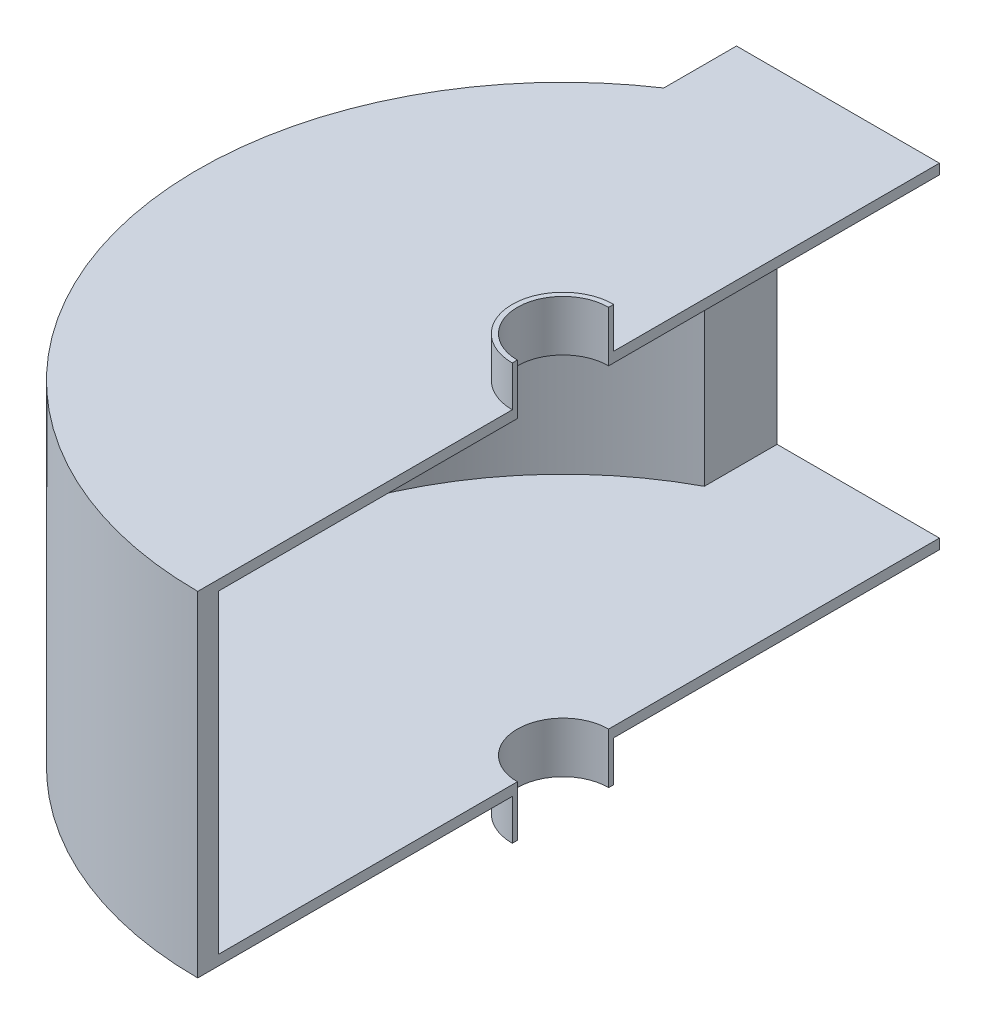
ISO-10303-21;
HEADER;
FILE_DESCRIPTION(('STEP AP214'),'2;1');
FILE_NAME('part.step','',(''),(''),'','','');
FILE_SCHEMA(('AUTOMOTIVE_DESIGN { 1 0 10303 214 1 1 1 1 }'));
ENDSEC;
DATA;
#1=APPLICATION_CONTEXT('core data for automotive mechanical design processes');
#2=APPLICATION_PROTOCOL_DEFINITION('international standard','automotive_design',2000,#1);
#3=PRODUCT_CONTEXT('',#1,'mechanical');
#4=PRODUCT('Part','Part','',(#3));
#5=PRODUCT_RELATED_PRODUCT_CATEGORY('part','',(#4));
#6=PRODUCT_DEFINITION_FORMATION('','',#4);
#7=PRODUCT_DEFINITION_CONTEXT('part definition',#1,'design');
#8=PRODUCT_DEFINITION('design','',#6,#7);
#9=PRODUCT_DEFINITION_SHAPE('','',#8);
#10=(LENGTH_UNIT() NAMED_UNIT(*) SI_UNIT(.MILLI.,.METRE.));
#11=(NAMED_UNIT(*) PLANE_ANGLE_UNIT() SI_UNIT($,.RADIAN.));
#12=(NAMED_UNIT(*) SI_UNIT($,.STERADIAN.) SOLID_ANGLE_UNIT());
#13=UNCERTAINTY_MEASURE_WITH_UNIT(LENGTH_MEASURE(1.E-05),#10,'distance_accuracy_value','');
#14=(GEOMETRIC_REPRESENTATION_CONTEXT(3) GLOBAL_UNCERTAINTY_ASSIGNED_CONTEXT((#13)) GLOBAL_UNIT_ASSIGNED_CONTEXT((#10,
#11,#12)) REPRESENTATION_CONTEXT('',''));
#15=CARTESIAN_POINT('',(0.,0.,0.));
#16=DIRECTION('',(0.,0.,1.));
#17=DIRECTION('',(1.,0.,0.));
#18=AXIS2_PLACEMENT_3D('',#15,#16,#17);
#19=CARTESIAN_POINT('',(0.,-5.,0.));
#20=DIRECTION('',(0.,1.,0.));
#21=DIRECTION('',(0.,0.,1.));
#22=AXIS2_PLACEMENT_3D('',#19,#20,#21);
#23=PLANE('',#22);
#24=CARTESIAN_POINT('',(0.,-5.,0.));
#25=DIRECTION('',(0.,1.,0.));
#26=DIRECTION('',(0.,0.,-1.));
#27=AXIS2_PLACEMENT_3D('',#24,#25,#26);
#28=CIRCLE('',#27,169.705627484771);
#29=CARTESIAN_POINT('',(-80.,-5.,-149.666295470958));
#30=VERTEX_POINT('',#29);
#31=CARTESIAN_POINT('',(0.,-5.,169.705627484771));
#32=VERTEX_POINT('',#31);
#33=EDGE_CURVE('E196',#30,#32,#28,.T.);
#34=ORIENTED_EDGE('',*,*,#33,.F.);
#35=DIRECTION('',(0.,0.,1.));
#36=VECTOR('',#35,1.);
#37=CARTESIAN_POINT('',(-80.,-5.,-185.5));
#38=LINE('',#37,#36);
#39=CARTESIAN_POINT('',(-80.,-5.,-185.5));
#40=VERTEX_POINT('',#39);
#41=EDGE_CURVE('E51',#40,#30,#38,.T.);
#42=ORIENTED_EDGE('',*,*,#41,.F.);
#43=DIRECTION('',(-1.,0.,0.));
#44=VECTOR('',#43,1.);
#45=CARTESIAN_POINT('',(0.,-5.,-185.5));
#46=LINE('',#45,#44);
#47=CARTESIAN_POINT('',(0.,-5.,-185.5));
#48=VERTEX_POINT('',#47);
#49=EDGE_CURVE('E213',#48,#40,#46,.T.);
#50=ORIENTED_EDGE('',*,*,#49,.F.);
#51=DIRECTION('',(0.,0.,-1.));
#52=VECTOR('',#51,1.);
#53=CARTESIAN_POINT('',(0.,-5.,-25.));
#54=LINE('',#53,#52);
#55=CARTESIAN_POINT('',(0.,-5.,-22.5));
#56=VERTEX_POINT('',#55);
#57=EDGE_CURVE('E322',#56,#48,#54,.T.);
#58=ORIENTED_EDGE('',*,*,#57,.F.);
#59=CARTESIAN_POINT('',(0.,-5.,0.));
#60=DIRECTION('',(0.,-1.,0.));
#61=DIRECTION('',(0.,0.,1.));
#62=AXIS2_PLACEMENT_3D('',#59,#60,#61);
#63=CIRCLE('',#62,22.5);
#64=CARTESIAN_POINT('',(0.,-5.,22.5));
#65=VERTEX_POINT('',#64);
#66=EDGE_CURVE('E319',#65,#56,#63,.T.);
#67=ORIENTED_EDGE('',*,*,#66,.F.);
#68=DIRECTION('',(0.,0.,-1.));
#69=VECTOR('',#68,1.);
#70=CARTESIAN_POINT('',(0.,-5.,22.5));
#71=LINE('',#70,#69);
#72=EDGE_CURVE('E57',#32,#65,#71,.T.);
#73=ORIENTED_EDGE('',*,*,#72,.F.);
#74=EDGE_LOOP('',(#34,#42,#50,#58,#67,#73));
#75=FACE_BOUND('',#74,.T.);
#76=ADVANCED_FACE('F34',(#75),#23,.F.);
#77=CARTESIAN_POINT('',(0.,-5.,0.));
#78=DIRECTION('',(0.,1.,0.));
#79=DIRECTION('',(0.,0.,1.));
#80=AXIS2_PLACEMENT_3D('',#77,#78,#79);
#81=CYLINDRICAL_SURFACE('',#80,22.5);
#82=DIRECTION('',(0.,1.,0.));
#83=VECTOR('',#82,1.);
#84=CARTESIAN_POINT('',(0.,-5.,-22.5));
#85=LINE('',#84,#83);
#86=CARTESIAN_POINT('',(0.,20.,-22.5));
#87=VERTEX_POINT('',#86);
#88=EDGE_CURVE('E327',#56,#87,#85,.T.);
#89=ORIENTED_EDGE('',*,*,#88,.T.);
#90=CARTESIAN_POINT('',(0.,20.,0.));
#91=DIRECTION('',(0.,-1.,0.));
#92=DIRECTION('',(0.,0.,1.));
#93=AXIS2_PLACEMENT_3D('',#90,#91,#92);
#94=CIRCLE('',#93,22.5);
#95=CARTESIAN_POINT('',(0.,20.,22.5));
#96=VERTEX_POINT('',#95);
#97=EDGE_CURVE('E305',#96,#87,#94,.T.);
#98=ORIENTED_EDGE('',*,*,#97,.F.);
#99=DIRECTION('',(0.,1.,0.));
#100=VECTOR('',#99,1.);
#101=CARTESIAN_POINT('',(0.,-5.,22.5));
#102=LINE('',#101,#100);
#103=EDGE_CURVE('E11',#65,#96,#102,.T.);
#104=ORIENTED_EDGE('',*,*,#103,.F.);
#105=ORIENTED_EDGE('',*,*,#66,.T.);
#106=EDGE_LOOP('',(#89,#98,#104,#105));
#107=FACE_BOUND('',#106,.T.);
#108=ADVANCED_FACE('F36',(#107),#81,.F.);
#109=CARTESIAN_POINT('',(0.,-5.,22.5));
#110=DIRECTION('',(1.,0.,0.));
#111=DIRECTION('',(0.,0.,-1.));
#112=AXIS2_PLACEMENT_3D('',#109,#110,#111);
#113=PLANE('',#112);
#114=ORIENTED_EDGE('',*,*,#103,.T.);
#115=DIRECTION('',(0.,0.,-1.));
#116=VECTOR('',#115,1.);
#117=CARTESIAN_POINT('',(0.,20.,22.5));
#118=LINE('',#117,#116);
#119=CARTESIAN_POINT('',(0.,20.,25.));
#120=VERTEX_POINT('',#119);
#121=EDGE_CURVE('E316',#120,#96,#118,.T.);
#122=ORIENTED_EDGE('',*,*,#121,.F.);
#123=DIRECTION('',(0.,1.,0.));
#124=VECTOR('',#123,1.);
#125=CARTESIAN_POINT('',(0.,-5.,25.));
#126=LINE('',#125,#124);
#127=CARTESIAN_POINT('',(0.,0.,25.));
#128=VERTEX_POINT('',#127);
#129=EDGE_CURVE('E43',#128,#120,#126,.T.);
#130=ORIENTED_EDGE('',*,*,#129,.F.);
#131=DIRECTION('',(0.,0.,1.));
#132=VECTOR('',#131,1.);
#133=CARTESIAN_POINT('',(0.,0.,0.));
#134=LINE('',#133,#132);
#135=CARTESIAN_POINT('',(0.,0.,180.));
#136=VERTEX_POINT('',#135);
#137=EDGE_CURVE('E205',#128,#136,#134,.T.);
#138=ORIENTED_EDGE('',*,*,#137,.T.);
#139=DIRECTION('',(0.,1.,0.));
#140=VECTOR('',#139,1.);
#141=CARTESIAN_POINT('',(0.,-5.,180.));
#142=LINE('',#141,#140);
#143=CARTESIAN_POINT('',(0.,-165.,180.));
#144=VERTEX_POINT('',#143);
#145=EDGE_CURVE('E303',#144,#136,#142,.T.);
#146=ORIENTED_EDGE('',*,*,#145,.F.);
#147=DIRECTION('',(0.,0.,1.));
#148=VECTOR('',#147,1.);
#149=CARTESIAN_POINT('',(0.,-165.,0.));
#150=LINE('',#149,#148);
#151=CARTESIAN_POINT('',(0.,-165.,25.));
#152=VERTEX_POINT('',#151);
#153=EDGE_CURVE('E249',#152,#144,#150,.T.);
#154=ORIENTED_EDGE('',*,*,#153,.F.);
#155=DIRECTION('',(0.,-1.,0.));
#156=VECTOR('',#155,1.);
#157=CARTESIAN_POINT('',(0.,-160.,25.));
#158=LINE('',#157,#156);
#159=CARTESIAN_POINT('',(0.,-185.,25.));
#160=VERTEX_POINT('',#159);
#161=EDGE_CURVE('E241',#152,#160,#158,.T.);
#162=ORIENTED_EDGE('',*,*,#161,.T.);
#163=DIRECTION('',(0.,0.,-1.));
#164=VECTOR('',#163,1.);
#165=CARTESIAN_POINT('',(0.,-185.,22.5));
#166=LINE('',#165,#164);
#167=CARTESIAN_POINT('',(0.,-185.,22.5));
#168=VERTEX_POINT('',#167);
#169=EDGE_CURVE('E180',#160,#168,#166,.T.);
#170=ORIENTED_EDGE('',*,*,#169,.T.);
#171=DIRECTION('',(0.,-1.,0.));
#172=VECTOR('',#171,1.);
#173=CARTESIAN_POINT('',(0.,-160.,22.5));
#174=LINE('',#173,#172);
#175=CARTESIAN_POINT('',(0.,-160.,22.5));
#176=VERTEX_POINT('',#175);
#177=EDGE_CURVE('E186',#176,#168,#174,.T.);
#178=ORIENTED_EDGE('',*,*,#177,.F.);
#179=DIRECTION('',(0.,0.,-1.));
#180=VECTOR('',#179,1.);
#181=CARTESIAN_POINT('',(0.,-160.,22.5));
#182=LINE('',#181,#180);
#183=CARTESIAN_POINT('',(0.,-160.,169.705627484771));
#184=VERTEX_POINT('',#183);
#185=EDGE_CURVE('E176',#184,#176,#182,.T.);
#186=ORIENTED_EDGE('',*,*,#185,.F.);
#187=DIRECTION('',(0.,1.,0.));
#188=VECTOR('',#187,1.);
#189=CARTESIAN_POINT('',(0.,-500000.,169.705627484771));
#190=LINE('',#189,#188);
#191=EDGE_CURVE('E200',#184,#32,#190,.T.);
#192=ORIENTED_EDGE('',*,*,#191,.T.);
#193=ORIENTED_EDGE('',*,*,#72,.T.);
#194=EDGE_LOOP('',(#114,#122,#130,#138,#146,#154,#162,#170,#178,#186,#192,#193));
#195=FACE_BOUND('',#194,.T.);
#196=ADVANCED_FACE('F234',(#195),#113,.T.);
#197=CARTESIAN_POINT('',(0.,-5.,0.));
#198=DIRECTION('',(0.,1.,0.));
#199=DIRECTION('',(0.,0.,1.));
#200=AXIS2_PLACEMENT_3D('',#197,#198,#199);
#201=CYLINDRICAL_SURFACE('',#200,25.);
#202=CARTESIAN_POINT('',(0.,0.,0.));
#203=DIRECTION('',(0.,1.,0.));
#204=DIRECTION('',(0.,0.,1.));
#205=AXIS2_PLACEMENT_3D('',#202,#203,#204);
#206=CIRCLE('',#205,25.);
#207=CARTESIAN_POINT('',(0.,0.,-25.));
#208=VERTEX_POINT('',#207);
#209=EDGE_CURVE('E299',#128,#208,#206,.F.);
#210=ORIENTED_EDGE('',*,*,#209,.F.);
#211=ORIENTED_EDGE('',*,*,#129,.T.);
#212=CARTESIAN_POINT('',(0.,20.,0.));
#213=DIRECTION('',(0.,1.,0.));
#214=DIRECTION('',(0.,0.,1.));
#215=AXIS2_PLACEMENT_3D('',#212,#213,#214);
#216=CIRCLE('',#215,25.);
#217=CARTESIAN_POINT('',(0.,20.,-25.));
#218=VERTEX_POINT('',#217);
#219=EDGE_CURVE('E313',#218,#120,#216,.T.);
#220=ORIENTED_EDGE('',*,*,#219,.F.);
#221=DIRECTION('',(0.,1.,0.));
#222=VECTOR('',#221,1.);
#223=CARTESIAN_POINT('',(0.,-5.,-25.));
#224=LINE('',#223,#222);
#225=EDGE_CURVE('E326',#208,#218,#224,.T.);
#226=ORIENTED_EDGE('',*,*,#225,.F.);
#227=EDGE_LOOP('',(#210,#211,#220,#226));
#228=FACE_BOUND('',#227,.T.);
#229=ADVANCED_FACE('F362',(#228),#201,.T.);
#230=CARTESIAN_POINT('',(0.,-5.,-25.));
#231=DIRECTION('',(1.,0.,0.));
#232=DIRECTION('',(0.,0.,-1.));
#233=AXIS2_PLACEMENT_3D('',#230,#231,#232);
#234=PLANE('',#233);
#235=ORIENTED_EDGE('',*,*,#57,.T.);
#236=DIRECTION('',(0.,1.,0.));
#237=VECTOR('',#236,1.);
#238=CARTESIAN_POINT('',(0.,-5.,-185.5));
#239=LINE('',#238,#237);
#240=CARTESIAN_POINT('',(0.,0.,-185.5));
#241=VERTEX_POINT('',#240);
#242=EDGE_CURVE('E216',#48,#241,#239,.T.);
#243=ORIENTED_EDGE('',*,*,#242,.T.);
#244=DIRECTION('',(0.,0.,-1.));
#245=VECTOR('',#244,1.);
#246=CARTESIAN_POINT('',(0.,0.,0.));
#247=LINE('',#246,#245);
#248=EDGE_CURVE('E297',#208,#241,#247,.T.);
#249=ORIENTED_EDGE('',*,*,#248,.F.);
#250=ORIENTED_EDGE('',*,*,#225,.T.);
#251=DIRECTION('',(0.,0.,-1.));
#252=VECTOR('',#251,1.);
#253=CARTESIAN_POINT('',(0.,20.,-25.));
#254=LINE('',#253,#252);
#255=EDGE_CURVE('E310',#87,#218,#254,.T.);
#256=ORIENTED_EDGE('',*,*,#255,.F.);
#257=ORIENTED_EDGE('',*,*,#88,.F.);
#258=EDGE_LOOP('',(#235,#243,#249,#250,#256,#257));
#259=FACE_BOUND('',#258,.T.);
#260=ADVANCED_FACE('F335',(#259),#234,.T.);
#261=CARTESIAN_POINT('',(0.,20.,0.));
#262=DIRECTION('',(0.,1.,0.));
#263=DIRECTION('',(0.,0.,1.));
#264=AXIS2_PLACEMENT_3D('',#261,#262,#263);
#265=PLANE('',#264);
#266=ORIENTED_EDGE('',*,*,#97,.T.);
#267=ORIENTED_EDGE('',*,*,#255,.T.);
#268=ORIENTED_EDGE('',*,*,#219,.T.);
#269=ORIENTED_EDGE('',*,*,#121,.T.);
#270=EDGE_LOOP('',(#266,#267,#268,#269));
#271=FACE_BOUND('',#270,.T.);
#272=ADVANCED_FACE('F338',(#271),#265,.T.);
#273=CARTESIAN_POINT('',(0.,-5.,0.));
#274=DIRECTION('',(0.,1.,0.));
#275=DIRECTION('',(0.,0.,1.));
#276=AXIS2_PLACEMENT_3D('',#273,#274,#275);
#277=CYLINDRICAL_SURFACE('',#276,180.);
#278=CARTESIAN_POINT('',(0.,0.,0.));
#279=DIRECTION('',(0.,1.,0.));
#280=DIRECTION('',(0.,0.,1.));
#281=AXIS2_PLACEMENT_3D('',#278,#279,#280);
#282=CIRCLE('',#281,180.);
#283=CARTESIAN_POINT('',(-100.,0.,-149.666295470958));
#284=VERTEX_POINT('',#283);
#285=EDGE_CURVE('E217',#284,#136,#282,.T.);
#286=ORIENTED_EDGE('',*,*,#285,.F.);
#287=DIRECTION('',(0.,1.,0.));
#288=VECTOR('',#287,1.);
#289=CARTESIAN_POINT('',(-100.,-5.,-149.666295470958));
#290=LINE('',#289,#288);
#291=CARTESIAN_POINT('',(-100.,-165.,-149.666295470958));
#292=VERTEX_POINT('',#291);
#293=EDGE_CURVE('E284',#292,#284,#290,.T.);
#294=ORIENTED_EDGE('',*,*,#293,.F.);
#295=CARTESIAN_POINT('',(0.,-165.,0.));
#296=DIRECTION('',(0.,1.,0.));
#297=DIRECTION('',(0.,0.,1.));
#298=AXIS2_PLACEMENT_3D('',#295,#296,#297);
#299=CIRCLE('',#298,180.);
#300=EDGE_CURVE('E161',#292,#144,#299,.T.);
#301=ORIENTED_EDGE('',*,*,#300,.T.);
#302=ORIENTED_EDGE('',*,*,#145,.T.);
#303=EDGE_LOOP('',(#286,#294,#301,#302));
#304=FACE_BOUND('',#303,.T.);
#305=ADVANCED_FACE('F343',(#304),#277,.T.);
#306=CARTESIAN_POINT('',(-99.9999999999999,-5.,0.));
#307=DIRECTION('',(-1.,0.,0.));
#308=DIRECTION('',(0.,0.,1.));
#309=AXIS2_PLACEMENT_3D('',#306,#307,#308);
#310=PLANE('',#309);
#311=DIRECTION('',(0.,0.,1.));
#312=VECTOR('',#311,1.);
#313=CARTESIAN_POINT('',(-99.9999999999999,0.,0.));
#314=LINE('',#313,#312);
#315=CARTESIAN_POINT('',(-100.,0.,-185.5));
#316=VERTEX_POINT('',#315);
#317=EDGE_CURVE('E287',#316,#284,#314,.T.);
#318=ORIENTED_EDGE('',*,*,#317,.F.);
#319=DIRECTION('',(0.,1.,0.));
#320=VECTOR('',#319,1.);
#321=CARTESIAN_POINT('',(-100.,-5.,-185.5));
#322=LINE('',#321,#320);
#323=CARTESIAN_POINT('',(-100.,-165.,-185.5));
#324=VERTEX_POINT('',#323);
#325=EDGE_CURVE('E277',#324,#316,#322,.T.);
#326=ORIENTED_EDGE('',*,*,#325,.F.);
#327=DIRECTION('',(0.,0.,1.));
#328=VECTOR('',#327,1.);
#329=CARTESIAN_POINT('',(-99.9999999999999,-165.,0.));
#330=LINE('',#329,#328);
#331=EDGE_CURVE('E265',#324,#292,#330,.T.);
#332=ORIENTED_EDGE('',*,*,#331,.T.);
#333=ORIENTED_EDGE('',*,*,#293,.T.);
#334=EDGE_LOOP('',(#318,#326,#332,#333));
#335=FACE_BOUND('',#334,.T.);
#336=ADVANCED_FACE('F288',(#335),#310,.T.);
#337=CARTESIAN_POINT('',(0.,-5.,-185.5));
#338=DIRECTION('',(0.,0.,-1.));
#339=DIRECTION('',(-1.,0.,0.));
#340=AXIS2_PLACEMENT_3D('',#337,#338,#339);
#341=PLANE('',#340);
#342=DIRECTION('',(-1.,0.,0.));
#343=VECTOR('',#342,1.);
#344=CARTESIAN_POINT('',(0.,0.,-185.5));
#345=LINE('',#344,#343);
#346=EDGE_CURVE('E281',#241,#316,#345,.T.);
#347=ORIENTED_EDGE('',*,*,#346,.F.);
#348=ORIENTED_EDGE('',*,*,#242,.F.);
#349=ORIENTED_EDGE('',*,*,#49,.T.);
#350=DIRECTION('',(0.,1.,0.));
#351=VECTOR('',#350,1.);
#352=CARTESIAN_POINT('',(-80.,-500000.,-185.5));
#353=LINE('',#352,#351);
#354=CARTESIAN_POINT('',(-80.,-159.999999999968,-185.5));
#355=VERTEX_POINT('',#354);
#356=EDGE_CURVE('E157',#355,#40,#353,.T.);
#357=ORIENTED_EDGE('',*,*,#356,.F.);
#358=DIRECTION('',(-1.,0.,0.));
#359=VECTOR('',#358,1.);
#360=CARTESIAN_POINT('',(0.,-160.,-185.5));
#361=LINE('',#360,#359);
#362=CARTESIAN_POINT('',(0.,-160.,-185.5));
#363=VERTEX_POINT('',#362);
#364=EDGE_CURVE('E149',#363,#355,#361,.T.);
#365=ORIENTED_EDGE('',*,*,#364,.F.);
#366=DIRECTION('',(0.,-1.,0.));
#367=VECTOR('',#366,1.);
#368=CARTESIAN_POINT('',(0.,-160.,-185.5));
#369=LINE('',#368,#367);
#370=CARTESIAN_POINT('',(0.,-165.,-185.5));
#371=VERTEX_POINT('',#370);
#372=EDGE_CURVE('E154',#363,#371,#369,.T.);
#373=ORIENTED_EDGE('',*,*,#372,.T.);
#374=DIRECTION('',(-1.,0.,0.));
#375=VECTOR('',#374,1.);
#376=CARTESIAN_POINT('',(0.,-165.,-185.5));
#377=LINE('',#376,#375);
#378=EDGE_CURVE('E268',#371,#324,#377,.T.);
#379=ORIENTED_EDGE('',*,*,#378,.T.);
#380=ORIENTED_EDGE('',*,*,#325,.T.);
#381=EDGE_LOOP('',(#347,#348,#349,#357,#365,#373,#379,#380));
#382=FACE_BOUND('',#381,.T.);
#383=ADVANCED_FACE('F152',(#382),#341,.T.);
#384=CARTESIAN_POINT('',(0.,0.,0.));
#385=DIRECTION('',(0.,1.,0.));
#386=DIRECTION('',(0.,0.,1.));
#387=AXIS2_PLACEMENT_3D('',#384,#385,#386);
#388=PLANE('',#387);
#389=ORIENTED_EDGE('',*,*,#137,.F.);
#390=ORIENTED_EDGE('',*,*,#209,.T.);
#391=ORIENTED_EDGE('',*,*,#248,.T.);
#392=ORIENTED_EDGE('',*,*,#346,.T.);
#393=ORIENTED_EDGE('',*,*,#317,.T.);
#394=ORIENTED_EDGE('',*,*,#285,.T.);
#395=EDGE_LOOP('',(#389,#390,#391,#392,#393,#394));
#396=FACE_BOUND('',#395,.T.);
#397=ADVANCED_FACE('F294',(#396),#388,.T.);
#398=CARTESIAN_POINT('',(-80.,-500000.,-185.5));
#399=DIRECTION('',(-1.,0.,0.));
#400=DIRECTION('',(0.,0.,1.));
#401=AXIS2_PLACEMENT_3D('',#398,#399,#400);
#402=PLANE('',#401);
#403=DIRECTION('',(0.,0.,1.));
#404=VECTOR('',#403,1.);
#405=CARTESIAN_POINT('',(-80.,-160.000000000025,-185.5));
#406=LINE('',#405,#404);
#407=CARTESIAN_POINT('',(-80.,-160.000000000025,-149.666295470958));
#408=VERTEX_POINT('',#407);
#409=EDGE_CURVE('E206',#355,#408,#406,.T.);
#410=ORIENTED_EDGE('',*,*,#409,.F.);
#411=ORIENTED_EDGE('',*,*,#356,.T.);
#412=ORIENTED_EDGE('',*,*,#41,.T.);
#413=DIRECTION('',(0.,1.,0.));
#414=VECTOR('',#413,1.);
#415=CARTESIAN_POINT('',(-80.,-500000.,-149.666295470958));
#416=LINE('',#415,#414);
#417=EDGE_CURVE('E193',#408,#30,#416,.T.);
#418=ORIENTED_EDGE('',*,*,#417,.F.);
#419=EDGE_LOOP('',(#410,#411,#412,#418));
#420=FACE_BOUND('',#419,.T.);
#421=ADVANCED_FACE('F232',(#420),#402,.F.);
#422=CARTESIAN_POINT('',(0.,-500000.,0.));
#423=DIRECTION('',(0.,1.,0.));
#424=DIRECTION('',(0.,0.,1.));
#425=AXIS2_PLACEMENT_3D('',#422,#423,#424);
#426=CYLINDRICAL_SURFACE('',#425,169.705627484771);
#427=CARTESIAN_POINT('',(0.,-160.000000000025,0.));
#428=DIRECTION('',(0.,-1.,0.));
#429=DIRECTION('',(0.,0.,-1.));
#430=AXIS2_PLACEMENT_3D('',#427,#428,#429);
#431=CIRCLE('',#430,169.705627484771);
#432=EDGE_CURVE('E203',#408,#184,#431,.F.);
#433=ORIENTED_EDGE('',*,*,#432,.F.);
#434=ORIENTED_EDGE('',*,*,#417,.T.);
#435=ORIENTED_EDGE('',*,*,#33,.T.);
#436=ORIENTED_EDGE('',*,*,#191,.F.);
#437=EDGE_LOOP('',(#433,#434,#435,#436));
#438=FACE_BOUND('',#437,.T.);
#439=ADVANCED_FACE('F230',(#438),#426,.F.);
#440=CARTESIAN_POINT('',(0.,-160.,0.));
#441=DIRECTION('',(0.,-1.,0.));
#442=DIRECTION('',(0.,0.,1.));
#443=AXIS2_PLACEMENT_3D('',#440,#441,#442);
#444=PLANE('',#443);
#445=ORIENTED_EDGE('',*,*,#364,.T.);
#446=ORIENTED_EDGE('',*,*,#409,.T.);
#447=ORIENTED_EDGE('',*,*,#432,.T.);
#448=ORIENTED_EDGE('',*,*,#185,.T.);
#449=CARTESIAN_POINT('',(0.,-160.,0.));
#450=DIRECTION('',(0.,-1.,0.));
#451=DIRECTION('',(0.,0.,1.));
#452=AXIS2_PLACEMENT_3D('',#449,#450,#451);
#453=CIRCLE('',#452,22.5);
#454=CARTESIAN_POINT('',(0.,-160.,-22.5));
#455=VERTEX_POINT('',#454);
#456=EDGE_CURVE('E174',#176,#455,#453,.T.);
#457=ORIENTED_EDGE('',*,*,#456,.T.);
#458=DIRECTION('',(0.,0.,-1.));
#459=VECTOR('',#458,1.);
#460=CARTESIAN_POINT('',(0.,-160.,-25.));
#461=LINE('',#460,#459);
#462=EDGE_CURVE('E166',#455,#363,#461,.T.);
#463=ORIENTED_EDGE('',*,*,#462,.T.);
#464=EDGE_LOOP('',(#445,#446,#447,#448,#457,#463));
#465=FACE_BOUND('',#464,.T.);
#466=ADVANCED_FACE('F172',(#465),#444,.F.);
#467=CARTESIAN_POINT('',(0.,-160.,0.));
#468=DIRECTION('',(0.,-1.,0.));
#469=DIRECTION('',(0.,0.,1.));
#470=AXIS2_PLACEMENT_3D('',#467,#468,#469);
#471=CYLINDRICAL_SURFACE('',#470,22.5);
#472=DIRECTION('',(0.,-1.,0.));
#473=VECTOR('',#472,1.);
#474=CARTESIAN_POINT('',(0.,-160.,-22.5));
#475=LINE('',#474,#473);
#476=CARTESIAN_POINT('',(0.,-185.,-22.5));
#477=VERTEX_POINT('',#476);
#478=EDGE_CURVE('E178',#455,#477,#475,.T.);
#479=ORIENTED_EDGE('',*,*,#478,.F.);
#480=ORIENTED_EDGE('',*,*,#456,.F.);
#481=ORIENTED_EDGE('',*,*,#177,.T.);
#482=CARTESIAN_POINT('',(0.,-185.,0.));
#483=DIRECTION('',(0.,-1.,0.));
#484=DIRECTION('',(0.,0.,1.));
#485=AXIS2_PLACEMENT_3D('',#482,#483,#484);
#486=CIRCLE('',#485,22.5);
#487=EDGE_CURVE('E170',#168,#477,#486,.T.);
#488=ORIENTED_EDGE('',*,*,#487,.T.);
#489=EDGE_LOOP('',(#479,#480,#481,#488));
#490=FACE_BOUND('',#489,.T.);
#491=ADVANCED_FACE('F242',(#490),#471,.F.);
#492=CARTESIAN_POINT('',(0.,-160.,0.));
#493=DIRECTION('',(0.,-1.,0.));
#494=DIRECTION('',(0.,0.,1.));
#495=AXIS2_PLACEMENT_3D('',#492,#493,#494);
#496=CYLINDRICAL_SURFACE('',#495,25.);
#497=CARTESIAN_POINT('',(0.,-165.,0.));
#498=DIRECTION('',(0.,1.,0.));
#499=DIRECTION('',(0.,0.,1.));
#500=AXIS2_PLACEMENT_3D('',#497,#498,#499);
#501=CIRCLE('',#500,25.);
#502=CARTESIAN_POINT('',(0.,-165.,-25.));
#503=VERTEX_POINT('',#502);
#504=EDGE_CURVE('E253',#152,#503,#501,.F.);
#505=ORIENTED_EDGE('',*,*,#504,.T.);
#506=DIRECTION('',(0.,-1.,0.));
#507=VECTOR('',#506,1.);
#508=CARTESIAN_POINT('',(0.,-160.,-25.));
#509=LINE('',#508,#507);
#510=CARTESIAN_POINT('',(0.,-185.,-25.));
#511=VERTEX_POINT('',#510);
#512=EDGE_CURVE('E243',#503,#511,#509,.T.);
#513=ORIENTED_EDGE('',*,*,#512,.T.);
#514=CARTESIAN_POINT('',(0.,-185.,0.));
#515=DIRECTION('',(0.,1.,0.));
#516=DIRECTION('',(0.,0.,1.));
#517=AXIS2_PLACEMENT_3D('',#514,#515,#516);
#518=CIRCLE('',#517,25.);
#519=EDGE_CURVE('E255',#511,#160,#518,.T.);
#520=ORIENTED_EDGE('',*,*,#519,.T.);
#521=ORIENTED_EDGE('',*,*,#161,.F.);
#522=EDGE_LOOP('',(#505,#513,#520,#521));
#523=FACE_BOUND('',#522,.T.);
#524=ADVANCED_FACE('F252',(#523),#496,.T.);
#525=CARTESIAN_POINT('',(0.,-160.,-25.));
#526=DIRECTION('',(1.,0.,0.));
#527=DIRECTION('',(0.,0.,-1.));
#528=AXIS2_PLACEMENT_3D('',#525,#526,#527);
#529=PLANE('',#528);
#530=ORIENTED_EDGE('',*,*,#462,.F.);
#531=ORIENTED_EDGE('',*,*,#478,.T.);
#532=DIRECTION('',(0.,0.,-1.));
#533=VECTOR('',#532,1.);
#534=CARTESIAN_POINT('',(0.,-185.,-25.));
#535=LINE('',#534,#533);
#536=EDGE_CURVE('E257',#477,#511,#535,.T.);
#537=ORIENTED_EDGE('',*,*,#536,.T.);
#538=ORIENTED_EDGE('',*,*,#512,.F.);
#539=DIRECTION('',(0.,0.,-1.));
#540=VECTOR('',#539,1.);
#541=CARTESIAN_POINT('',(0.,-165.,0.));
#542=LINE('',#541,#540);
#543=EDGE_CURVE('E169',#503,#371,#542,.T.);
#544=ORIENTED_EDGE('',*,*,#543,.T.);
#545=ORIENTED_EDGE('',*,*,#372,.F.);
#546=EDGE_LOOP('',(#530,#531,#537,#538,#544,#545));
#547=FACE_BOUND('',#546,.T.);
#548=ADVANCED_FACE('F164',(#547),#529,.T.);
#549=CARTESIAN_POINT('',(0.,-185.,0.));
#550=DIRECTION('',(0.,-1.,0.));
#551=DIRECTION('',(0.,0.,1.));
#552=AXIS2_PLACEMENT_3D('',#549,#550,#551);
#553=PLANE('',#552);
#554=ORIENTED_EDGE('',*,*,#487,.F.);
#555=ORIENTED_EDGE('',*,*,#169,.F.);
#556=ORIENTED_EDGE('',*,*,#519,.F.);
#557=ORIENTED_EDGE('',*,*,#536,.F.);
#558=EDGE_LOOP('',(#554,#555,#556,#557));
#559=FACE_BOUND('',#558,.T.);
#560=ADVANCED_FACE('F259',(#559),#553,.T.);
#561=CARTESIAN_POINT('',(0.,-165.,0.));
#562=DIRECTION('',(0.,-1.,0.));
#563=DIRECTION('',(0.,0.,1.));
#564=AXIS2_PLACEMENT_3D('',#561,#562,#563);
#565=PLANE('',#564);
#566=ORIENTED_EDGE('',*,*,#153,.T.);
#567=ORIENTED_EDGE('',*,*,#300,.F.);
#568=ORIENTED_EDGE('',*,*,#331,.F.);
#569=ORIENTED_EDGE('',*,*,#378,.F.);
#570=ORIENTED_EDGE('',*,*,#543,.F.);
#571=ORIENTED_EDGE('',*,*,#504,.F.);
#572=EDGE_LOOP('',(#566,#567,#568,#569,#570,#571));
#573=FACE_BOUND('',#572,.T.);
#574=ADVANCED_FACE('F275',(#573),#565,.T.);
#575=CLOSED_SHELL('',(#76,#108,#196,#229,#260,#272,#305,#336,#383,#397,#421,#439,#466,#491,#524,
#548,#560,#574));
#576=MANIFOLD_SOLID_BREP('B2',#575);
#577=ADVANCED_BREP_SHAPE_REPRESENTATION('',(#18,#576),#14);
#578=SHAPE_DEFINITION_REPRESENTATION(#9,#577);
ENDSEC;
END-ISO-10303-21;
